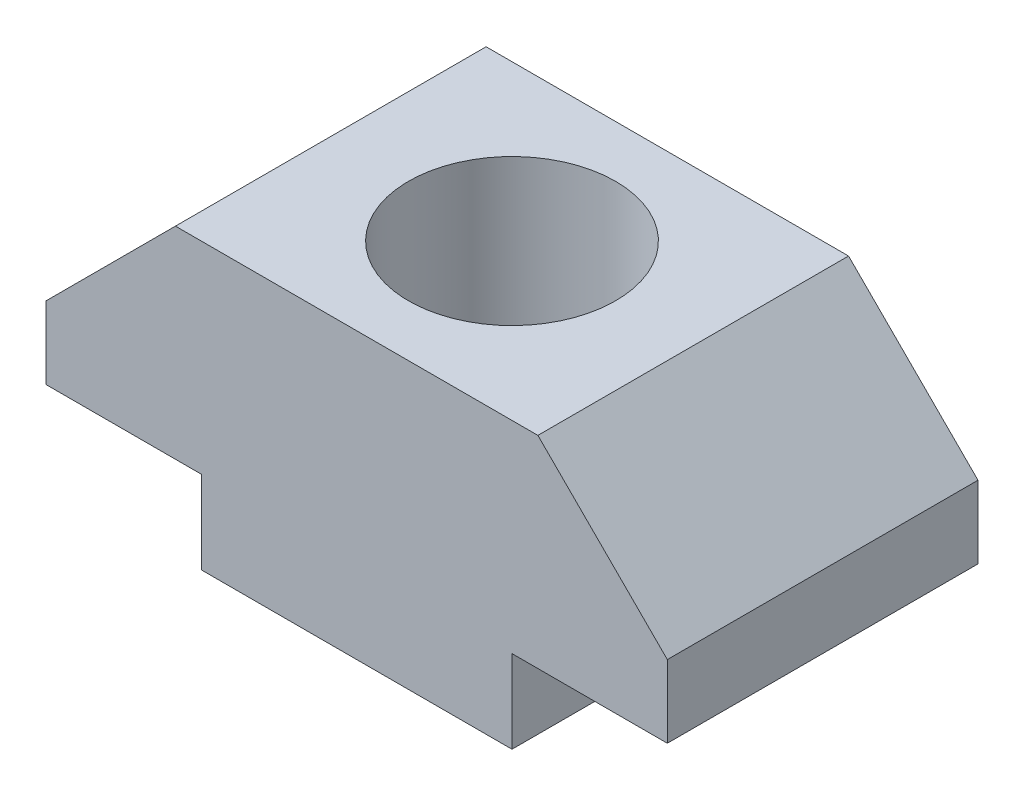
ISO-10303-21;
HEADER;
FILE_DESCRIPTION(('STEP AP214'),'2;1');
FILE_NAME('part.step','',(''),(''),'','','');
FILE_SCHEMA(('AUTOMOTIVE_DESIGN { 1 0 10303 214 1 1 1 1 }'));
ENDSEC;
DATA;
#1=APPLICATION_CONTEXT('core data for automotive mechanical design processes');
#2=APPLICATION_PROTOCOL_DEFINITION('international standard','automotive_design',2000,#1);
#3=PRODUCT_CONTEXT('',#1,'mechanical');
#4=PRODUCT('Part','Part','',(#3));
#5=PRODUCT_RELATED_PRODUCT_CATEGORY('part','',(#4));
#6=PRODUCT_DEFINITION_FORMATION('','',#4);
#7=PRODUCT_DEFINITION_CONTEXT('part definition',#1,'design');
#8=PRODUCT_DEFINITION('design','',#6,#7);
#9=PRODUCT_DEFINITION_SHAPE('','',#8);
#10=(LENGTH_UNIT() NAMED_UNIT(*) SI_UNIT(.MILLI.,.METRE.));
#11=(NAMED_UNIT(*) PLANE_ANGLE_UNIT() SI_UNIT($,.RADIAN.));
#12=(NAMED_UNIT(*) SI_UNIT($,.STERADIAN.) SOLID_ANGLE_UNIT());
#13=UNCERTAINTY_MEASURE_WITH_UNIT(LENGTH_MEASURE(1.E-05),#10,'distance_accuracy_value','');
#14=(GEOMETRIC_REPRESENTATION_CONTEXT(3) GLOBAL_UNCERTAINTY_ASSIGNED_CONTEXT((#13)) GLOBAL_UNIT_ASSIGNED_CONTEXT((#10,
#11,#12)) REPRESENTATION_CONTEXT('',''));
#15=CARTESIAN_POINT('',(0.,0.,0.));
#16=DIRECTION('',(0.,0.,1.));
#17=DIRECTION('',(1.,0.,0.));
#18=AXIS2_PLACEMENT_3D('',#15,#16,#17);
#19=CARTESIAN_POINT('',(3.5,5.5,3.));
#20=DIRECTION('',(0.,-1.,0.));
#21=DIRECTION('',(1.,0.,0.));
#22=AXIS2_PLACEMENT_3D('',#19,#20,#21);
#23=PLANE('',#22);
#24=DIRECTION('',(-1.,0.,0.));
#25=VECTOR('',#24,1.);
#26=CARTESIAN_POINT('',(3.5,5.5,-3.));
#27=LINE('',#26,#25);
#28=CARTESIAN_POINT('',(3.5,5.5,-3.));
#29=VERTEX_POINT('',#28);
#30=CARTESIAN_POINT('',(-3.5,5.5,-3.));
#31=VERTEX_POINT('',#30);
#32=EDGE_CURVE('E153',#29,#31,#27,.T.);
#33=ORIENTED_EDGE('',*,*,#32,.T.);
#34=DIRECTION('',(0.,0.,-1.));
#35=VECTOR('',#34,1.);
#36=CARTESIAN_POINT('',(-3.5,5.5,3.));
#37=LINE('',#36,#35);
#38=CARTESIAN_POINT('',(-3.5,5.5,3.));
#39=VERTEX_POINT('',#38);
#40=EDGE_CURVE('E169',#39,#31,#37,.T.);
#41=ORIENTED_EDGE('',*,*,#40,.F.);
#42=DIRECTION('',(-1.,0.,0.));
#43=VECTOR('',#42,1.);
#44=CARTESIAN_POINT('',(3.5,5.5,3.));
#45=LINE('',#44,#43);
#46=CARTESIAN_POINT('',(3.5,5.5,3.));
#47=VERTEX_POINT('',#46);
#48=EDGE_CURVE('E198',#47,#39,#45,.T.);
#49=ORIENTED_EDGE('',*,*,#48,.F.);
#50=DIRECTION('',(0.,0.,-1.));
#51=VECTOR('',#50,1.);
#52=CARTESIAN_POINT('',(3.5,5.5,3.));
#53=LINE('',#52,#51);
#54=EDGE_CURVE('E172',#47,#29,#53,.T.);
#55=ORIENTED_EDGE('',*,*,#54,.T.);
#56=EDGE_LOOP('',(#33,#41,#49,#55));
#57=FACE_BOUND('',#56,.T.);
#58=CARTESIAN_POINT('',(0.,5.5,0.));
#59=DIRECTION('',(0.,-1.,0.));
#60=DIRECTION('',(1.,0.,0.));
#61=AXIS2_PLACEMENT_3D('',#58,#59,#60);
#62=CIRCLE('',#61,2.);
#63=CARTESIAN_POINT('',(0.,5.5,-2.));
#64=VERTEX_POINT('',#63);
#65=EDGE_CURVE('E209',#64,#64,#62,.T.);
#66=ORIENTED_EDGE('',*,*,#65,.T.);
#67=EDGE_LOOP('',(#66));
#68=FACE_BOUND('',#67,.T.);
#69=ADVANCED_FACE('F34',(#57,#68),#23,.F.);
#70=CARTESIAN_POINT('',(-2.99999999999999,0.,3.));
#71=DIRECTION('',(0.,1.,0.));
#72=DIRECTION('',(-1.,0.,0.));
#73=AXIS2_PLACEMENT_3D('',#70,#71,#72);
#74=PLANE('',#73);
#75=DIRECTION('',(1.,0.,0.));
#76=VECTOR('',#75,1.);
#77=CARTESIAN_POINT('',(-2.99999999999999,0.,-3.));
#78=LINE('',#77,#76);
#79=CARTESIAN_POINT('',(-2.99999999999999,0.,-3.));
#80=VERTEX_POINT('',#79);
#81=CARTESIAN_POINT('',(3.00000000000003,0.,-3.));
#82=VERTEX_POINT('',#81);
#83=EDGE_CURVE('E92',#80,#82,#78,.T.);
#84=ORIENTED_EDGE('',*,*,#83,.T.);
#85=DIRECTION('',(0.,0.,-1.));
#86=VECTOR('',#85,1.);
#87=CARTESIAN_POINT('',(3.00000000000003,0.,3.));
#88=LINE('',#87,#86);
#89=CARTESIAN_POINT('',(3.00000000000003,0.,3.));
#90=VERTEX_POINT('',#89);
#91=EDGE_CURVE('E139',#90,#82,#88,.T.);
#92=ORIENTED_EDGE('',*,*,#91,.F.);
#93=DIRECTION('',(1.,0.,0.));
#94=VECTOR('',#93,1.);
#95=CARTESIAN_POINT('',(-2.99999999999999,0.,3.));
#96=LINE('',#95,#94);
#97=CARTESIAN_POINT('',(-2.99999999999999,0.,3.));
#98=VERTEX_POINT('',#97);
#99=EDGE_CURVE('E51',#98,#90,#96,.T.);
#100=ORIENTED_EDGE('',*,*,#99,.F.);
#101=DIRECTION('',(0.,0.,-1.));
#102=VECTOR('',#101,1.);
#103=CARTESIAN_POINT('',(-2.99999999999999,0.,3.));
#104=LINE('',#103,#102);
#105=EDGE_CURVE('E135',#98,#80,#104,.T.);
#106=ORIENTED_EDGE('',*,*,#105,.T.);
#107=EDGE_LOOP('',(#84,#92,#100,#106));
#108=FACE_BOUND('',#107,.T.);
#109=CARTESIAN_POINT('',(0.,0.,0.));
#110=DIRECTION('',(0.,1.,0.));
#111=DIRECTION('',(0.,0.,1.));
#112=AXIS2_PLACEMENT_3D('',#109,#110,#111);
#113=CIRCLE('',#112,2.);
#114=CARTESIAN_POINT('',(0.,0.,-2.));
#115=VERTEX_POINT('',#114);
#116=EDGE_CURVE('E147',#115,#115,#113,.T.);
#117=ORIENTED_EDGE('',*,*,#116,.T.);
#118=EDGE_LOOP('',(#117));
#119=FACE_BOUND('',#118,.T.);
#120=ADVANCED_FACE('F215',(#108,#119),#74,.F.);
#121=CARTESIAN_POINT('',(3.00000000000003,0.,3.));
#122=DIRECTION('',(-1.,0.,0.));
#123=DIRECTION('',(0.,-1.,0.));
#124=AXIS2_PLACEMENT_3D('',#121,#122,#123);
#125=PLANE('',#124);
#126=DIRECTION('',(0.,1.,0.));
#127=VECTOR('',#126,1.);
#128=CARTESIAN_POINT('',(3.00000000000003,0.,-3.));
#129=LINE('',#128,#127);
#130=CARTESIAN_POINT('',(3.00000000000004,1.6,-3.));
#131=VERTEX_POINT('',#130);
#132=EDGE_CURVE('E143',#82,#131,#129,.T.);
#133=ORIENTED_EDGE('',*,*,#132,.T.);
#134=DIRECTION('',(0.,0.,-1.));
#135=VECTOR('',#134,1.);
#136=CARTESIAN_POINT('',(3.00000000000004,1.6,3.));
#137=LINE('',#136,#135);
#138=CARTESIAN_POINT('',(3.00000000000004,1.6,3.));
#139=VERTEX_POINT('',#138);
#140=EDGE_CURVE('E11',#139,#131,#137,.T.);
#141=ORIENTED_EDGE('',*,*,#140,.F.);
#142=DIRECTION('',(0.,1.,0.));
#143=VECTOR('',#142,1.);
#144=CARTESIAN_POINT('',(3.00000000000003,0.,3.));
#145=LINE('',#144,#143);
#146=EDGE_CURVE('E162',#90,#139,#145,.T.);
#147=ORIENTED_EDGE('',*,*,#146,.F.);
#148=ORIENTED_EDGE('',*,*,#91,.T.);
#149=EDGE_LOOP('',(#133,#141,#147,#148));
#150=FACE_BOUND('',#149,.T.);
#151=ADVANCED_FACE('F36',(#150),#125,.F.);
#152=CARTESIAN_POINT('',(3.00000000000004,1.6,3.));
#153=DIRECTION('',(0.,1.,0.));
#154=DIRECTION('',(-1.,0.,0.));
#155=AXIS2_PLACEMENT_3D('',#152,#153,#154);
#156=PLANE('',#155);
#157=DIRECTION('',(1.,0.,0.));
#158=VECTOR('',#157,1.);
#159=CARTESIAN_POINT('',(3.00000000000004,1.6,-3.));
#160=LINE('',#159,#158);
#161=CARTESIAN_POINT('',(6.00000000000003,1.6,-3.));
#162=VERTEX_POINT('',#161);
#163=EDGE_CURVE('E146',#131,#162,#160,.T.);
#164=ORIENTED_EDGE('',*,*,#163,.T.);
#165=DIRECTION('',(0.,0.,-1.));
#166=VECTOR('',#165,1.);
#167=CARTESIAN_POINT('',(6.00000000000003,1.6,3.));
#168=LINE('',#167,#166);
#169=CARTESIAN_POINT('',(6.00000000000003,1.6,3.));
#170=VERTEX_POINT('',#169);
#171=EDGE_CURVE('E43',#170,#162,#168,.T.);
#172=ORIENTED_EDGE('',*,*,#171,.F.);
#173=DIRECTION('',(1.,0.,0.));
#174=VECTOR('',#173,1.);
#175=CARTESIAN_POINT('',(3.00000000000004,1.6,3.));
#176=LINE('',#175,#174);
#177=EDGE_CURVE('E100',#139,#170,#176,.T.);
#178=ORIENTED_EDGE('',*,*,#177,.F.);
#179=ORIENTED_EDGE('',*,*,#140,.T.);
#180=EDGE_LOOP('',(#164,#172,#178,#179));
#181=FACE_BOUND('',#180,.T.);
#182=ADVANCED_FACE('F235',(#181),#156,.F.);
#183=CARTESIAN_POINT('',(6.00000000000003,1.6,3.));
#184=DIRECTION('',(-1.,0.,0.));
#185=DIRECTION('',(0.,-1.,0.));
#186=AXIS2_PLACEMENT_3D('',#183,#184,#185);
#187=PLANE('',#186);
#188=DIRECTION('',(0.,1.,0.));
#189=VECTOR('',#188,1.);
#190=CARTESIAN_POINT('',(6.00000000000003,1.6,-3.));
#191=LINE('',#190,#189);
#192=CARTESIAN_POINT('',(6.,2.99999999999999,-3.));
#193=VERTEX_POINT('',#192);
#194=EDGE_CURVE('E149',#162,#193,#191,.T.);
#195=ORIENTED_EDGE('',*,*,#194,.T.);
#196=DIRECTION('',(0.,0.,-1.));
#197=VECTOR('',#196,1.);
#198=CARTESIAN_POINT('',(6.,2.99999999999999,3.));
#199=LINE('',#198,#197);
#200=CARTESIAN_POINT('',(6.,2.99999999999999,3.));
#201=VERTEX_POINT('',#200);
#202=EDGE_CURVE('E175',#201,#193,#199,.T.);
#203=ORIENTED_EDGE('',*,*,#202,.F.);
#204=DIRECTION('',(0.,1.,0.));
#205=VECTOR('',#204,1.);
#206=CARTESIAN_POINT('',(6.00000000000003,1.6,3.));
#207=LINE('',#206,#205);
#208=EDGE_CURVE('E183',#170,#201,#207,.T.);
#209=ORIENTED_EDGE('',*,*,#208,.F.);
#210=ORIENTED_EDGE('',*,*,#171,.T.);
#211=EDGE_LOOP('',(#195,#203,#209,#210));
#212=FACE_BOUND('',#211,.T.);
#213=ADVANCED_FACE('F181',(#212),#187,.F.);
#214=CARTESIAN_POINT('',(6.,2.99999999999999,3.));
#215=DIRECTION('',(-0.707106781186549,-0.707106781186546,0.));
#216=DIRECTION('',(0.707106781186546,-0.707106781186549,0.));
#217=AXIS2_PLACEMENT_3D('',#214,#215,#216);
#218=PLANE('',#217);
#219=DIRECTION('',(-0.707106781186546,0.707106781186549,0.));
#220=VECTOR('',#219,1.);
#221=CARTESIAN_POINT('',(6.,2.99999999999999,-3.));
#222=LINE('',#221,#220);
#223=EDGE_CURVE('E151',#193,#29,#222,.T.);
#224=ORIENTED_EDGE('',*,*,#223,.T.);
#225=ORIENTED_EDGE('',*,*,#54,.F.);
#226=DIRECTION('',(-0.707106781186546,0.707106781186549,0.));
#227=VECTOR('',#226,1.);
#228=CARTESIAN_POINT('',(6.,2.99999999999999,3.));
#229=LINE('',#228,#227);
#230=EDGE_CURVE('E201',#201,#47,#229,.T.);
#231=ORIENTED_EDGE('',*,*,#230,.F.);
#232=ORIENTED_EDGE('',*,*,#202,.T.);
#233=EDGE_LOOP('',(#224,#225,#231,#232));
#234=FACE_BOUND('',#233,.T.);
#235=ADVANCED_FACE('F192',(#234),#218,.F.);
#236=CARTESIAN_POINT('',(-3.5,5.5,3.));
#237=DIRECTION('',(0.707106781186549,-0.707106781186546,0.));
#238=DIRECTION('',(0.707106781186546,0.707106781186549,0.));
#239=AXIS2_PLACEMENT_3D('',#236,#237,#238);
#240=PLANE('',#239);
#241=DIRECTION('',(-0.707106781186546,-0.707106781186549,0.));
#242=VECTOR('',#241,1.);
#243=CARTESIAN_POINT('',(-3.5,5.5,-3.));
#244=LINE('',#243,#242);
#245=CARTESIAN_POINT('',(-6.,2.99999999999999,-3.));
#246=VERTEX_POINT('',#245);
#247=EDGE_CURVE('E155',#31,#246,#244,.T.);
#248=ORIENTED_EDGE('',*,*,#247,.T.);
#249=DIRECTION('',(0.,0.,-1.));
#250=VECTOR('',#249,1.);
#251=CARTESIAN_POINT('',(-6.,2.99999999999999,3.));
#252=LINE('',#251,#250);
#253=CARTESIAN_POINT('',(-6.,2.99999999999999,3.));
#254=VERTEX_POINT('',#253);
#255=EDGE_CURVE('E166',#254,#246,#252,.T.);
#256=ORIENTED_EDGE('',*,*,#255,.F.);
#257=DIRECTION('',(-0.707106781186546,-0.707106781186549,0.));
#258=VECTOR('',#257,1.);
#259=CARTESIAN_POINT('',(-3.5,5.5,3.));
#260=LINE('',#259,#258);
#261=EDGE_CURVE('E200',#39,#254,#260,.T.);
#262=ORIENTED_EDGE('',*,*,#261,.F.);
#263=ORIENTED_EDGE('',*,*,#40,.T.);
#264=EDGE_LOOP('',(#248,#256,#262,#263));
#265=FACE_BOUND('',#264,.T.);
#266=ADVANCED_FACE('F230',(#265),#240,.F.);
#267=CARTESIAN_POINT('',(-6.,2.99999999999999,3.));
#268=DIRECTION('',(1.,0.,0.));
#269=DIRECTION('',(0.,1.,0.));
#270=AXIS2_PLACEMENT_3D('',#267,#268,#269);
#271=PLANE('',#270);
#272=DIRECTION('',(0.,-1.,0.));
#273=VECTOR('',#272,1.);
#274=CARTESIAN_POINT('',(-6.,2.99999999999999,-3.));
#275=LINE('',#274,#273);
#276=CARTESIAN_POINT('',(-5.99999999999998,1.6,-3.));
#277=VERTEX_POINT('',#276);
#278=EDGE_CURVE('E157',#246,#277,#275,.T.);
#279=ORIENTED_EDGE('',*,*,#278,.T.);
#280=DIRECTION('',(0.,0.,-1.));
#281=VECTOR('',#280,1.);
#282=CARTESIAN_POINT('',(-5.99999999999998,1.6,3.));
#283=LINE('',#282,#281);
#284=CARTESIAN_POINT('',(-5.99999999999998,1.6,3.));
#285=VERTEX_POINT('',#284);
#286=EDGE_CURVE('E134',#285,#277,#283,.T.);
#287=ORIENTED_EDGE('',*,*,#286,.F.);
#288=DIRECTION('',(0.,-1.,0.));
#289=VECTOR('',#288,1.);
#290=CARTESIAN_POINT('',(-6.,2.99999999999999,3.));
#291=LINE('',#290,#289);
#292=EDGE_CURVE('E125',#254,#285,#291,.T.);
#293=ORIENTED_EDGE('',*,*,#292,.F.);
#294=ORIENTED_EDGE('',*,*,#255,.T.);
#295=EDGE_LOOP('',(#279,#287,#293,#294));
#296=FACE_BOUND('',#295,.T.);
#297=ADVANCED_FACE('F245',(#296),#271,.F.);
#298=CARTESIAN_POINT('',(-5.99999999999998,1.6,3.));
#299=DIRECTION('',(0.,1.,0.));
#300=DIRECTION('',(0.,0.,1.));
#301=AXIS2_PLACEMENT_3D('',#298,#299,#300);
#302=PLANE('',#301);
#303=DIRECTION('',(1.,0.,0.));
#304=VECTOR('',#303,1.);
#305=CARTESIAN_POINT('',(-5.99999999999998,1.6,-3.));
#306=LINE('',#305,#304);
#307=CARTESIAN_POINT('',(-3.,1.6,-3.));
#308=VERTEX_POINT('',#307);
#309=EDGE_CURVE('E133',#277,#308,#306,.T.);
#310=ORIENTED_EDGE('',*,*,#309,.T.);
#311=DIRECTION('',(0.,0.,-1.));
#312=VECTOR('',#311,1.);
#313=CARTESIAN_POINT('',(-3.,1.6,3.));
#314=LINE('',#313,#312);
#315=CARTESIAN_POINT('',(-3.,1.6,3.));
#316=VERTEX_POINT('',#315);
#317=EDGE_CURVE('E130',#316,#308,#314,.T.);
#318=ORIENTED_EDGE('',*,*,#317,.F.);
#319=DIRECTION('',(1.,0.,0.));
#320=VECTOR('',#319,1.);
#321=CARTESIAN_POINT('',(-5.99999999999998,1.6,3.));
#322=LINE('',#321,#320);
#323=EDGE_CURVE('E119',#285,#316,#322,.T.);
#324=ORIENTED_EDGE('',*,*,#323,.F.);
#325=ORIENTED_EDGE('',*,*,#286,.T.);
#326=EDGE_LOOP('',(#310,#318,#324,#325));
#327=FACE_BOUND('',#326,.T.);
#328=ADVANCED_FACE('F131',(#327),#302,.F.);
#329=CARTESIAN_POINT('',(-3.,1.6,3.));
#330=DIRECTION('',(1.,0.,0.));
#331=DIRECTION('',(0.,1.,0.));
#332=AXIS2_PLACEMENT_3D('',#329,#330,#331);
#333=PLANE('',#332);
#334=DIRECTION('',(0.,-1.,0.));
#335=VECTOR('',#334,1.);
#336=CARTESIAN_POINT('',(-3.,1.6,-3.));
#337=LINE('',#336,#335);
#338=EDGE_CURVE('E86',#308,#80,#337,.T.);
#339=ORIENTED_EDGE('',*,*,#338,.T.);
#340=ORIENTED_EDGE('',*,*,#105,.F.);
#341=DIRECTION('',(0.,-1.,0.));
#342=VECTOR('',#341,1.);
#343=CARTESIAN_POINT('',(-3.,1.6,3.));
#344=LINE('',#343,#342);
#345=EDGE_CURVE('E123',#316,#98,#344,.T.);
#346=ORIENTED_EDGE('',*,*,#345,.F.);
#347=ORIENTED_EDGE('',*,*,#317,.T.);
#348=EDGE_LOOP('',(#339,#340,#346,#347));
#349=FACE_BOUND('',#348,.T.);
#350=ADVANCED_FACE('F137',(#349),#333,.F.);
#351=CARTESIAN_POINT('',(3.00000000000004,1.6,3.));
#352=DIRECTION('',(0.,0.,-1.));
#353=DIRECTION('',(-1.,0.,0.));
#354=AXIS2_PLACEMENT_3D('',#351,#352,#353);
#355=PLANE('',#354);
#356=ORIENTED_EDGE('',*,*,#146,.T.);
#357=ORIENTED_EDGE('',*,*,#177,.T.);
#358=ORIENTED_EDGE('',*,*,#208,.T.);
#359=ORIENTED_EDGE('',*,*,#230,.T.);
#360=ORIENTED_EDGE('',*,*,#48,.T.);
#361=ORIENTED_EDGE('',*,*,#261,.T.);
#362=ORIENTED_EDGE('',*,*,#292,.T.);
#363=ORIENTED_EDGE('',*,*,#323,.T.);
#364=ORIENTED_EDGE('',*,*,#345,.T.);
#365=ORIENTED_EDGE('',*,*,#99,.T.);
#366=EDGE_LOOP('',(#356,#357,#358,#359,#360,#361,#362,#363,#364,#365));
#367=FACE_BOUND('',#366,.T.);
#368=ADVANCED_FACE('F121',(#367),#355,.F.);
#369=CARTESIAN_POINT('',(3.00000000000004,1.6,-3.));
#370=DIRECTION('',(0.,0.,-1.));
#371=DIRECTION('',(-1.,0.,0.));
#372=AXIS2_PLACEMENT_3D('',#369,#370,#371);
#373=PLANE('',#372);
#374=ORIENTED_EDGE('',*,*,#132,.F.);
#375=ORIENTED_EDGE('',*,*,#83,.F.);
#376=ORIENTED_EDGE('',*,*,#338,.F.);
#377=ORIENTED_EDGE('',*,*,#309,.F.);
#378=ORIENTED_EDGE('',*,*,#278,.F.);
#379=ORIENTED_EDGE('',*,*,#247,.F.);
#380=ORIENTED_EDGE('',*,*,#32,.F.);
#381=ORIENTED_EDGE('',*,*,#223,.F.);
#382=ORIENTED_EDGE('',*,*,#194,.F.);
#383=ORIENTED_EDGE('',*,*,#163,.F.);
#384=EDGE_LOOP('',(#374,#375,#376,#377,#378,#379,#380,#381,#382,#383));
#385=FACE_BOUND('',#384,.T.);
#386=ADVANCED_FACE('F187',(#385),#373,.T.);
#387=CARTESIAN_POINT('',(0.,5.501,0.));
#388=DIRECTION('',(0.,-1.,0.));
#389=DIRECTION('',(0.,0.,-1.));
#390=AXIS2_PLACEMENT_3D('',#387,#388,#389);
#391=CYLINDRICAL_SURFACE('',#390,2.);
#392=CARTESIAN_POINT('',(0.,0.,-2.));
#393=CARTESIAN_POINT('',(0.,0.0572916666666668,-2.));
#394=CARTESIAN_POINT('',(0.,0.114583333333333,-2.));
#395=CARTESIAN_POINT('',(0.,0.229166666666667,-2.));
#396=CARTESIAN_POINT('',(0.,0.286458333333334,-2.));
#397=CARTESIAN_POINT('',(0.,0.401041666666667,-2.));
#398=CARTESIAN_POINT('',(0.,0.458333333333334,-2.));
#399=CARTESIAN_POINT('',(0.,0.572916666666667,-2.));
#400=CARTESIAN_POINT('',(0.,0.630208333333334,-2.));
#401=CARTESIAN_POINT('',(0.,0.744791666666667,-2.));
#402=CARTESIAN_POINT('',(0.,0.802083333333333,-2.));
#403=CARTESIAN_POINT('',(0.,0.916666666666667,-2.));
#404=CARTESIAN_POINT('',(0.,0.973958333333333,-2.));
#405=CARTESIAN_POINT('',(0.,1.08854166666667,-2.));
#406=CARTESIAN_POINT('',(0.,1.14583333333333,-2.));
#407=CARTESIAN_POINT('',(0.,1.26041666666667,-2.));
#408=CARTESIAN_POINT('',(0.,1.31770833333333,-2.));
#409=CARTESIAN_POINT('',(0.,1.43229166666667,-2.));
#410=CARTESIAN_POINT('',(0.,1.48958333333333,-2.));
#411=CARTESIAN_POINT('',(0.,1.60416666666667,-2.));
#412=CARTESIAN_POINT('',(0.,1.66145833333333,-2.));
#413=CARTESIAN_POINT('',(0.,1.77604166666667,-2.));
#414=CARTESIAN_POINT('',(0.,1.83333333333333,-2.));
#415=CARTESIAN_POINT('',(0.,1.94791666666667,-2.));
#416=CARTESIAN_POINT('',(0.,2.00520833333333,-2.));
#417=CARTESIAN_POINT('',(0.,2.11979166666667,-2.));
#418=CARTESIAN_POINT('',(0.,2.17708333333333,-2.));
#419=CARTESIAN_POINT('',(0.,2.29166666666667,-2.));
#420=CARTESIAN_POINT('',(0.,2.34895833333333,-2.));
#421=CARTESIAN_POINT('',(0.,2.46354166666667,-2.));
#422=CARTESIAN_POINT('',(0.,2.52083333333333,-2.));
#423=CARTESIAN_POINT('',(0.,2.63541666666667,-2.));
#424=CARTESIAN_POINT('',(0.,2.69270833333333,-2.));
#425=CARTESIAN_POINT('',(0.,2.80729166666667,-2.));
#426=CARTESIAN_POINT('',(0.,2.86458333333333,-2.));
#427=CARTESIAN_POINT('',(0.,2.97916666666667,-2.));
#428=CARTESIAN_POINT('',(0.,3.03645833333333,-2.));
#429=CARTESIAN_POINT('',(0.,3.15104166666667,-2.));
#430=CARTESIAN_POINT('',(0.,3.20833333333333,-2.));
#431=CARTESIAN_POINT('',(0.,3.32291666666667,-2.));
#432=CARTESIAN_POINT('',(0.,3.38020833333333,-2.));
#433=CARTESIAN_POINT('',(0.,3.49479166666667,-2.));
#434=CARTESIAN_POINT('',(0.,3.55208333333333,-2.));
#435=CARTESIAN_POINT('',(0.,3.66666666666667,-2.));
#436=CARTESIAN_POINT('',(0.,3.72395833333333,-2.));
#437=CARTESIAN_POINT('',(0.,3.83854166666667,-2.));
#438=CARTESIAN_POINT('',(0.,3.89583333333333,-2.));
#439=CARTESIAN_POINT('',(0.,4.01041666666667,-2.));
#440=CARTESIAN_POINT('',(0.,4.06770833333333,-2.));
#441=CARTESIAN_POINT('',(0.,4.18229166666667,-2.));
#442=CARTESIAN_POINT('',(0.,4.23958333333333,-2.));
#443=CARTESIAN_POINT('',(0.,4.35416666666667,-2.));
#444=CARTESIAN_POINT('',(0.,4.41145833333333,-2.));
#445=CARTESIAN_POINT('',(0.,4.52604166666667,-2.));
#446=CARTESIAN_POINT('',(0.,4.58333333333333,-2.));
#447=CARTESIAN_POINT('',(0.,4.69791666666667,-2.));
#448=CARTESIAN_POINT('',(0.,4.75520833333333,-2.));
#449=CARTESIAN_POINT('',(0.,4.86979166666667,-2.));
#450=CARTESIAN_POINT('',(0.,4.92708333333333,-2.));
#451=CARTESIAN_POINT('',(0.,5.04166666666667,-2.));
#452=CARTESIAN_POINT('',(0.,5.09895833333333,-2.));
#453=CARTESIAN_POINT('',(0.,5.21354166666667,-2.));
#454=CARTESIAN_POINT('',(0.,5.27083333333333,-2.));
#455=CARTESIAN_POINT('',(0.,5.38541666666667,-2.));
#456=CARTESIAN_POINT('',(0.,5.44270833333333,-2.));
#457=CARTESIAN_POINT('',(0.,5.5,-2.));
#458=B_SPLINE_CURVE_WITH_KNOTS('',3,(#392,#393,#394,#395,#396,#397,#398,#399,#400,#401,#402,
#403,#404,#405,#406,#407,#408,#409,#410,#411,#412,#413,#414,#415,#416,#417,#418,#419,#420,#421,
#422,#423,#424,#425,#426,#427,#428,#429,#430,#431,#432,#433,#434,#435,#436,#437,#438,#439,#440,
#441,#442,#443,#444,#445,#446,#447,#448,#449,#450,#451,#452,#453,#454,#455,#456,#457),
.UNSPECIFIED.,.F.,.F.,(4,2,2,2,2,2,2,2,2,2,2,2,2,2,2,2,2,2,2,2,2,2,2,2,2,2,2,2,2,2,2,2,4),(0.,
0.171875,0.34375,0.515625,0.687500000000001,0.859375,1.03125,1.203125,1.375,1.546875,1.71875,
1.890625,2.0625,2.234375,2.40625,2.578125,2.75,2.921875,3.09375,3.265625,3.4375,3.609375,
3.78125,3.953125,4.125,4.296875,4.46875,4.640625,4.8125,4.984375,5.15625,5.328125,5.5),.UNSPECIFIED.);
#459=EDGE_CURVE('BSEAM217',#115,#64,#458,.T.);
#460=ORIENTED_EDGE('',*,*,#116,.F.);
#461=ORIENTED_EDGE('',*,*,#65,.F.);
#462=ORIENTED_EDGE('',*,*,#459,.T.);
#463=ORIENTED_EDGE('',*,*,#459,.F.);
#464=EDGE_LOOP('',(#460,#462,#461,#463));
#465=FACE_BOUND('',#464,.T.);
#466=ADVANCED_FACE('F217',(#465),#391,.F.);
#467=CLOSED_SHELL('',(#69,#120,#151,#182,#213,#235,#266,#297,#328,#350,#368,#386,#466));
#468=MANIFOLD_SOLID_BREP('B2',#467);
#469=ADVANCED_BREP_SHAPE_REPRESENTATION('',(#18,#468),#14);
#470=SHAPE_DEFINITION_REPRESENTATION(#9,#469);
ENDSEC;
END-ISO-10303-21;
